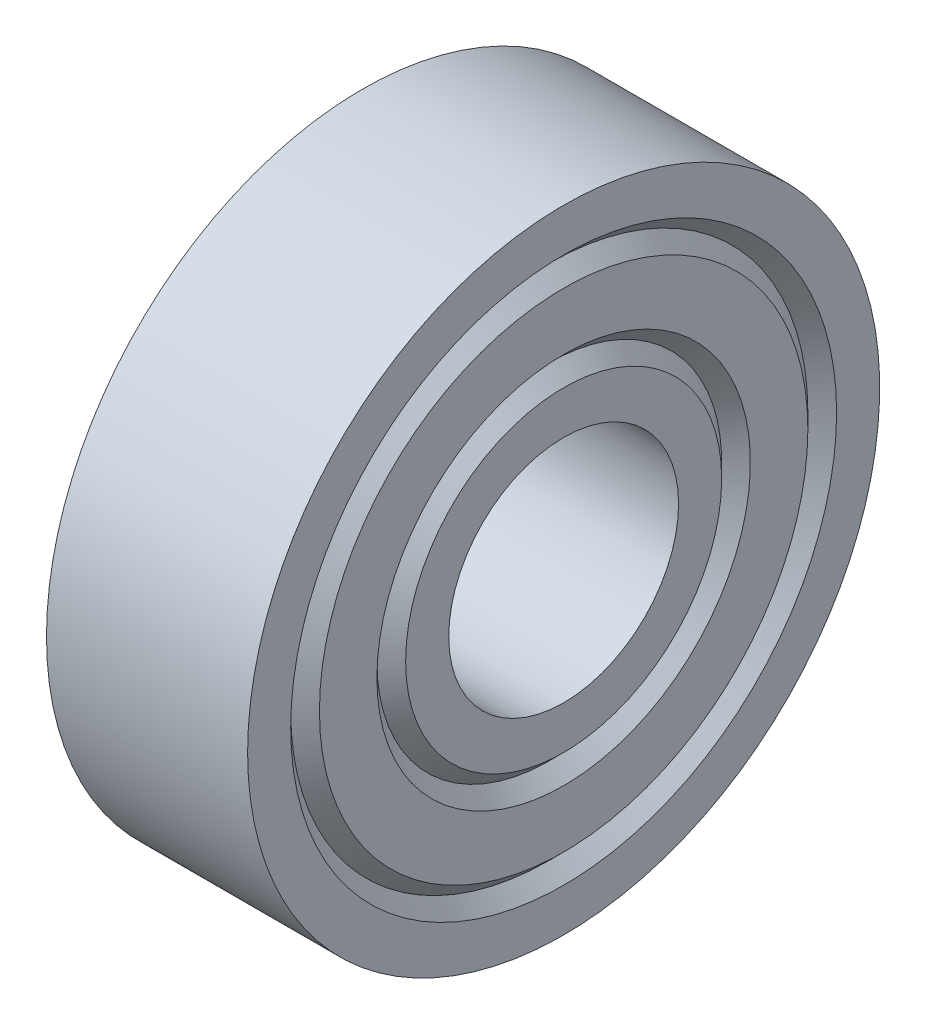
ISO-10303-21;
HEADER;
FILE_DESCRIPTION(('STEP AP214'),'2;1');
FILE_NAME('part.step','',(''),(''),'','','');
FILE_SCHEMA(('AUTOMOTIVE_DESIGN { 1 0 10303 214 1 1 1 1 }'));
ENDSEC;
DATA;
#1=APPLICATION_CONTEXT('core data for automotive mechanical design processes');
#2=APPLICATION_PROTOCOL_DEFINITION('international standard','automotive_design',2000,#1);
#3=PRODUCT_CONTEXT('',#1,'mechanical');
#4=PRODUCT('Part','Part','',(#3));
#5=PRODUCT_RELATED_PRODUCT_CATEGORY('part','',(#4));
#6=PRODUCT_DEFINITION_FORMATION('','',#4);
#7=PRODUCT_DEFINITION_CONTEXT('part definition',#1,'design');
#8=PRODUCT_DEFINITION('design','',#6,#7);
#9=PRODUCT_DEFINITION_SHAPE('','',#8);
#10=(LENGTH_UNIT() NAMED_UNIT(*) SI_UNIT(.MILLI.,.METRE.));
#11=(NAMED_UNIT(*) PLANE_ANGLE_UNIT() SI_UNIT($,.RADIAN.));
#12=(NAMED_UNIT(*) SI_UNIT($,.STERADIAN.) SOLID_ANGLE_UNIT());
#13=UNCERTAINTY_MEASURE_WITH_UNIT(LENGTH_MEASURE(1.E-05),#10,'distance_accuracy_value','');
#14=(GEOMETRIC_REPRESENTATION_CONTEXT(3) GLOBAL_UNCERTAINTY_ASSIGNED_CONTEXT((#13)) GLOBAL_UNIT_ASSIGNED_CONTEXT((#10,
#11,#12)) REPRESENTATION_CONTEXT('',''));
#15=CARTESIAN_POINT('',(0.,0.,0.));
#16=DIRECTION('',(0.,0.,1.));
#17=DIRECTION('',(1.,0.,0.));
#18=AXIS2_PLACEMENT_3D('',#15,#16,#17);
#19=CARTESIAN_POINT('',(-3.5,5.5,0.));
#20=DIRECTION('',(1.,0.,0.));
#21=DIRECTION('',(0.,0.,-1.));
#22=AXIS2_PLACEMENT_3D('',#19,#20,#21);
#23=PLANE('',#22);
#24=CARTESIAN_POINT('',(-3.5,0.,0.));
#25=DIRECTION('',(-1.,0.,0.));
#26=DIRECTION('',(0.,0.,1.));
#27=AXIS2_PLACEMENT_3D('',#24,#25,#26);
#28=CIRCLE('',#27,4.);
#29=CARTESIAN_POINT('',(-3.5,0.,4.));
#30=VERTEX_POINT('',#29);
#31=EDGE_CURVE('E85',#30,#30,#28,.T.);
#32=ORIENTED_EDGE('',*,*,#31,.F.);
#33=EDGE_LOOP('',(#32));
#34=FACE_BOUND('',#33,.T.);
#35=CARTESIAN_POINT('',(-3.5,0.,0.));
#36=DIRECTION('',(-1.,0.,0.));
#37=DIRECTION('',(0.,0.,1.));
#38=AXIS2_PLACEMENT_3D('',#35,#36,#37);
#39=CIRCLE('',#38,5.5);
#40=CARTESIAN_POINT('',(-3.5,0.,5.5));
#41=VERTEX_POINT('',#40);
#42=EDGE_CURVE('E10',#41,#41,#39,.T.);
#43=ORIENTED_EDGE('',*,*,#42,.T.);
#44=EDGE_LOOP('',(#43));
#45=FACE_BOUND('',#44,.T.);
#46=ADVANCED_FACE('F33',(#34,#45),#23,.F.);
#47=CARTESIAN_POINT('',(-3.,0.,0.));
#48=DIRECTION('',(1.,0.,0.));
#49=DIRECTION('',(0.,0.,-1.));
#50=AXIS2_PLACEMENT_3D('',#47,#48,#49);
#51=CONICAL_SURFACE('',#50,6.,0.785398163397448);
#52=ORIENTED_EDGE('',*,*,#42,.F.);
#53=EDGE_LOOP('',(#52));
#54=FACE_BOUND('',#53,.T.);
#55=CARTESIAN_POINT('',(-3.,0.,0.));
#56=DIRECTION('',(-1.,0.,0.));
#57=DIRECTION('',(0.,0.,1.));
#58=AXIS2_PLACEMENT_3D('',#55,#56,#57);
#59=CIRCLE('',#58,6.);
#60=CARTESIAN_POINT('',(-3.,0.,6.));
#61=VERTEX_POINT('',#60);
#62=EDGE_CURVE('E39',#61,#61,#59,.T.);
#63=ORIENTED_EDGE('',*,*,#62,.T.);
#64=EDGE_LOOP('',(#63));
#65=FACE_BOUND('',#64,.T.);
#66=ADVANCED_FACE('F92',(#54,#65),#51,.T.);
#67=CARTESIAN_POINT('',(-3.5,0.,0.));
#68=DIRECTION('',(-1.,0.,0.));
#69=DIRECTION('',(0.,0.,1.));
#70=AXIS2_PLACEMENT_3D('',#67,#68,#69);
#71=CONICAL_SURFACE('',#70,6.5,0.785398163397447);
#72=ORIENTED_EDGE('',*,*,#62,.F.);
#73=EDGE_LOOP('',(#72));
#74=FACE_BOUND('',#73,.T.);
#75=CARTESIAN_POINT('',(-3.5,0.,0.));
#76=DIRECTION('',(-1.,0.,0.));
#77=DIRECTION('',(0.,0.,1.));
#78=AXIS2_PLACEMENT_3D('',#75,#76,#77);
#79=CIRCLE('',#78,6.5);
#80=CARTESIAN_POINT('',(-3.5,0.,6.5));
#81=VERTEX_POINT('',#80);
#82=EDGE_CURVE('E43',#81,#81,#79,.T.);
#83=ORIENTED_EDGE('',*,*,#82,.T.);
#84=EDGE_LOOP('',(#83));
#85=FACE_BOUND('',#84,.T.);
#86=ADVANCED_FACE('F96',(#74,#85),#71,.F.);
#87=CARTESIAN_POINT('',(-3.5,8.5,0.));
#88=DIRECTION('',(1.,0.,0.));
#89=DIRECTION('',(0.,0.,-1.));
#90=AXIS2_PLACEMENT_3D('',#87,#88,#89);
#91=PLANE('',#90);
#92=ORIENTED_EDGE('',*,*,#82,.F.);
#93=EDGE_LOOP('',(#92));
#94=FACE_BOUND('',#93,.T.);
#95=CARTESIAN_POINT('',(-3.5,0.,0.));
#96=DIRECTION('',(-1.,0.,0.));
#97=DIRECTION('',(0.,0.,1.));
#98=AXIS2_PLACEMENT_3D('',#95,#96,#97);
#99=CIRCLE('',#98,8.5);
#100=CARTESIAN_POINT('',(-3.5,0.,8.5));
#101=VERTEX_POINT('',#100);
#102=EDGE_CURVE('E47',#101,#101,#99,.T.);
#103=ORIENTED_EDGE('',*,*,#102,.T.);
#104=EDGE_LOOP('',(#103));
#105=FACE_BOUND('',#104,.T.);
#106=ADVANCED_FACE('F101',(#94,#105),#91,.F.);
#107=CARTESIAN_POINT('',(-3.,0.,0.));
#108=DIRECTION('',(1.,0.,0.));
#109=DIRECTION('',(0.,0.,-1.));
#110=AXIS2_PLACEMENT_3D('',#107,#108,#109);
#111=CONICAL_SURFACE('',#110,9.,0.785398163397448);
#112=ORIENTED_EDGE('',*,*,#102,.F.);
#113=EDGE_LOOP('',(#112));
#114=FACE_BOUND('',#113,.T.);
#115=CARTESIAN_POINT('',(-3.,0.,0.));
#116=DIRECTION('',(-1.,0.,0.));
#117=DIRECTION('',(0.,0.,1.));
#118=AXIS2_PLACEMENT_3D('',#115,#116,#117);
#119=CIRCLE('',#118,9.);
#120=CARTESIAN_POINT('',(-3.,0.,9.));
#121=VERTEX_POINT('',#120);
#122=EDGE_CURVE('E52',#121,#121,#119,.T.);
#123=ORIENTED_EDGE('',*,*,#122,.T.);
#124=EDGE_LOOP('',(#123));
#125=FACE_BOUND('',#124,.T.);
#126=ADVANCED_FACE('F107',(#114,#125),#111,.T.);
#127=CARTESIAN_POINT('',(-3.5,0.,0.));
#128=DIRECTION('',(-1.,0.,0.));
#129=DIRECTION('',(0.,0.,1.));
#130=AXIS2_PLACEMENT_3D('',#127,#128,#129);
#131=CONICAL_SURFACE('',#130,9.5,0.785398163397448);
#132=ORIENTED_EDGE('',*,*,#122,.F.);
#133=EDGE_LOOP('',(#132));
#134=FACE_BOUND('',#133,.T.);
#135=CARTESIAN_POINT('',(-3.5,0.,0.));
#136=DIRECTION('',(-1.,0.,0.));
#137=DIRECTION('',(0.,0.,1.));
#138=AXIS2_PLACEMENT_3D('',#135,#136,#137);
#139=CIRCLE('',#138,9.5);
#140=CARTESIAN_POINT('',(-3.5,0.,9.5));
#141=VERTEX_POINT('',#140);
#142=EDGE_CURVE('E55',#141,#141,#139,.T.);
#143=ORIENTED_EDGE('',*,*,#142,.T.);
#144=EDGE_LOOP('',(#143));
#145=FACE_BOUND('',#144,.T.);
#146=ADVANCED_FACE('F111',(#134,#145),#131,.F.);
#147=CARTESIAN_POINT('',(-3.5,11.,0.));
#148=DIRECTION('',(1.,0.,0.));
#149=DIRECTION('',(0.,0.,-1.));
#150=AXIS2_PLACEMENT_3D('',#147,#148,#149);
#151=PLANE('',#150);
#152=ORIENTED_EDGE('',*,*,#142,.F.);
#153=EDGE_LOOP('',(#152));
#154=FACE_BOUND('',#153,.T.);
#155=CARTESIAN_POINT('',(-3.5,0.,0.));
#156=DIRECTION('',(-1.,0.,0.));
#157=DIRECTION('',(0.,0.,1.));
#158=AXIS2_PLACEMENT_3D('',#155,#156,#157);
#159=CIRCLE('',#158,11.);
#160=CARTESIAN_POINT('',(-3.5,0.,11.));
#161=VERTEX_POINT('',#160);
#162=EDGE_CURVE('E58',#161,#161,#159,.T.);
#163=ORIENTED_EDGE('',*,*,#162,.T.);
#164=EDGE_LOOP('',(#163));
#165=FACE_BOUND('',#164,.T.);
#166=ADVANCED_FACE('F115',(#154,#165),#151,.F.);
#167=CARTESIAN_POINT('',(0.,0.,0.));
#168=DIRECTION('',(-1.,0.,0.));
#169=DIRECTION('',(0.,0.,1.));
#170=AXIS2_PLACEMENT_3D('',#167,#168,#169);
#171=CYLINDRICAL_SURFACE('',#170,11.);
#172=ORIENTED_EDGE('',*,*,#162,.F.);
#173=EDGE_LOOP('',(#172));
#174=FACE_BOUND('',#173,.T.);
#175=CARTESIAN_POINT('',(3.5,0.,0.));
#176=DIRECTION('',(-1.,0.,0.));
#177=DIRECTION('',(0.,0.,1.));
#178=AXIS2_PLACEMENT_3D('',#175,#176,#177);
#179=CIRCLE('',#178,11.);
#180=CARTESIAN_POINT('',(3.5,0.,11.));
#181=VERTEX_POINT('',#180);
#182=EDGE_CURVE('E61',#181,#181,#179,.T.);
#183=ORIENTED_EDGE('',*,*,#182,.T.);
#184=EDGE_LOOP('',(#183));
#185=FACE_BOUND('',#184,.T.);
#186=ADVANCED_FACE('F119',(#174,#185),#171,.T.);
#187=CARTESIAN_POINT('',(3.5,9.5,0.));
#188=DIRECTION('',(-1.,0.,0.));
#189=DIRECTION('',(0.,0.,1.));
#190=AXIS2_PLACEMENT_3D('',#187,#188,#189);
#191=PLANE('',#190);
#192=ORIENTED_EDGE('',*,*,#182,.F.);
#193=EDGE_LOOP('',(#192));
#194=FACE_BOUND('',#193,.T.);
#195=CARTESIAN_POINT('',(3.5,0.,0.));
#196=DIRECTION('',(-1.,0.,0.));
#197=DIRECTION('',(0.,0.,1.));
#198=AXIS2_PLACEMENT_3D('',#195,#196,#197);
#199=CIRCLE('',#198,9.5);
#200=CARTESIAN_POINT('',(3.5,0.,9.5));
#201=VERTEX_POINT('',#200);
#202=EDGE_CURVE('E64',#201,#201,#199,.T.);
#203=ORIENTED_EDGE('',*,*,#202,.T.);
#204=EDGE_LOOP('',(#203));
#205=FACE_BOUND('',#204,.T.);
#206=ADVANCED_FACE('F123',(#194,#205),#191,.F.);
#207=CARTESIAN_POINT('',(3.,0.,0.));
#208=DIRECTION('',(1.,0.,0.));
#209=DIRECTION('',(0.,0.,-1.));
#210=AXIS2_PLACEMENT_3D('',#207,#208,#209);
#211=CONICAL_SURFACE('',#210,9.,0.785398163397448);
#212=ORIENTED_EDGE('',*,*,#202,.F.);
#213=EDGE_LOOP('',(#212));
#214=FACE_BOUND('',#213,.T.);
#215=CARTESIAN_POINT('',(3.,0.,0.));
#216=DIRECTION('',(-1.,0.,0.));
#217=DIRECTION('',(0.,0.,1.));
#218=AXIS2_PLACEMENT_3D('',#215,#216,#217);
#219=CIRCLE('',#218,9.);
#220=CARTESIAN_POINT('',(3.,0.,9.));
#221=VERTEX_POINT('',#220);
#222=EDGE_CURVE('E67',#221,#221,#219,.T.);
#223=ORIENTED_EDGE('',*,*,#222,.T.);
#224=EDGE_LOOP('',(#223));
#225=FACE_BOUND('',#224,.T.);
#226=ADVANCED_FACE('F127',(#214,#225),#211,.F.);
#227=CARTESIAN_POINT('',(3.5,0.,0.));
#228=DIRECTION('',(-1.,0.,0.));
#229=DIRECTION('',(0.,0.,1.));
#230=AXIS2_PLACEMENT_3D('',#227,#228,#229);
#231=CONICAL_SURFACE('',#230,8.5,0.785398163397452);
#232=ORIENTED_EDGE('',*,*,#222,.F.);
#233=EDGE_LOOP('',(#232));
#234=FACE_BOUND('',#233,.T.);
#235=CARTESIAN_POINT('',(3.5,0.,0.));
#236=DIRECTION('',(-1.,0.,0.));
#237=DIRECTION('',(0.,0.,1.));
#238=AXIS2_PLACEMENT_3D('',#235,#236,#237);
#239=CIRCLE('',#238,8.5);
#240=CARTESIAN_POINT('',(3.5,0.,8.5));
#241=VERTEX_POINT('',#240);
#242=EDGE_CURVE('E70',#241,#241,#239,.T.);
#243=ORIENTED_EDGE('',*,*,#242,.T.);
#244=EDGE_LOOP('',(#243));
#245=FACE_BOUND('',#244,.T.);
#246=ADVANCED_FACE('F131',(#234,#245),#231,.T.);
#247=CARTESIAN_POINT('',(3.5,6.5,0.));
#248=DIRECTION('',(-1.,0.,0.));
#249=DIRECTION('',(0.,0.,1.));
#250=AXIS2_PLACEMENT_3D('',#247,#248,#249);
#251=PLANE('',#250);
#252=ORIENTED_EDGE('',*,*,#242,.F.);
#253=EDGE_LOOP('',(#252));
#254=FACE_BOUND('',#253,.T.);
#255=CARTESIAN_POINT('',(3.5,0.,0.));
#256=DIRECTION('',(-1.,0.,0.));
#257=DIRECTION('',(0.,0.,1.));
#258=AXIS2_PLACEMENT_3D('',#255,#256,#257);
#259=CIRCLE('',#258,6.5);
#260=CARTESIAN_POINT('',(3.5,0.,6.5));
#261=VERTEX_POINT('',#260);
#262=EDGE_CURVE('E73',#261,#261,#259,.T.);
#263=ORIENTED_EDGE('',*,*,#262,.T.);
#264=EDGE_LOOP('',(#263));
#265=FACE_BOUND('',#264,.T.);
#266=ADVANCED_FACE('F135',(#254,#265),#251,.F.);
#267=CARTESIAN_POINT('',(3.,0.,0.));
#268=DIRECTION('',(1.,0.,0.));
#269=DIRECTION('',(0.,0.,-1.));
#270=AXIS2_PLACEMENT_3D('',#267,#268,#269);
#271=CONICAL_SURFACE('',#270,6.,0.785398163397449);
#272=ORIENTED_EDGE('',*,*,#262,.F.);
#273=EDGE_LOOP('',(#272));
#274=FACE_BOUND('',#273,.T.);
#275=CARTESIAN_POINT('',(3.,0.,0.));
#276=DIRECTION('',(-1.,0.,0.));
#277=DIRECTION('',(0.,0.,1.));
#278=AXIS2_PLACEMENT_3D('',#275,#276,#277);
#279=CIRCLE('',#278,6.);
#280=CARTESIAN_POINT('',(3.,0.,6.));
#281=VERTEX_POINT('',#280);
#282=EDGE_CURVE('E76',#281,#281,#279,.T.);
#283=ORIENTED_EDGE('',*,*,#282,.T.);
#284=EDGE_LOOP('',(#283));
#285=FACE_BOUND('',#284,.T.);
#286=ADVANCED_FACE('F139',(#274,#285),#271,.F.);
#287=CARTESIAN_POINT('',(3.5,0.,0.));
#288=DIRECTION('',(-1.,0.,0.));
#289=DIRECTION('',(0.,0.,1.));
#290=AXIS2_PLACEMENT_3D('',#287,#288,#289);
#291=CONICAL_SURFACE('',#290,5.5,0.785398163397452);
#292=ORIENTED_EDGE('',*,*,#282,.F.);
#293=EDGE_LOOP('',(#292));
#294=FACE_BOUND('',#293,.T.);
#295=CARTESIAN_POINT('',(3.5,0.,0.));
#296=DIRECTION('',(-1.,0.,0.));
#297=DIRECTION('',(0.,0.,1.));
#298=AXIS2_PLACEMENT_3D('',#295,#296,#297);
#299=CIRCLE('',#298,5.5);
#300=CARTESIAN_POINT('',(3.5,0.,5.5));
#301=VERTEX_POINT('',#300);
#302=EDGE_CURVE('E79',#301,#301,#299,.T.);
#303=ORIENTED_EDGE('',*,*,#302,.T.);
#304=EDGE_LOOP('',(#303));
#305=FACE_BOUND('',#304,.T.);
#306=ADVANCED_FACE('F143',(#294,#305),#291,.T.);
#307=CARTESIAN_POINT('',(3.5,4.,0.));
#308=DIRECTION('',(-1.,0.,0.));
#309=DIRECTION('',(0.,0.,1.));
#310=AXIS2_PLACEMENT_3D('',#307,#308,#309);
#311=PLANE('',#310);
#312=ORIENTED_EDGE('',*,*,#302,.F.);
#313=EDGE_LOOP('',(#312));
#314=FACE_BOUND('',#313,.T.);
#315=CARTESIAN_POINT('',(3.5,0.,0.));
#316=DIRECTION('',(-1.,0.,0.));
#317=DIRECTION('',(0.,0.,1.));
#318=AXIS2_PLACEMENT_3D('',#315,#316,#317);
#319=CIRCLE('',#318,4.);
#320=CARTESIAN_POINT('',(3.5,0.,4.));
#321=VERTEX_POINT('',#320);
#322=EDGE_CURVE('E82',#321,#321,#319,.T.);
#323=ORIENTED_EDGE('',*,*,#322,.T.);
#324=EDGE_LOOP('',(#323));
#325=FACE_BOUND('',#324,.T.);
#326=ADVANCED_FACE('F147',(#314,#325),#311,.F.);
#327=CARTESIAN_POINT('',(0.,0.,0.));
#328=DIRECTION('',(-1.,0.,0.));
#329=DIRECTION('',(0.,0.,1.));
#330=AXIS2_PLACEMENT_3D('',#327,#328,#329);
#331=CYLINDRICAL_SURFACE('',#330,4.);
#332=ORIENTED_EDGE('',*,*,#322,.F.);
#333=EDGE_LOOP('',(#332));
#334=FACE_BOUND('',#333,.T.);
#335=ORIENTED_EDGE('',*,*,#31,.T.);
#336=EDGE_LOOP('',(#335));
#337=FACE_BOUND('',#336,.T.);
#338=ADVANCED_FACE('F89',(#334,#337),#331,.F.);
#339=CLOSED_SHELL('',(#46,#66,#86,#106,#126,#146,#166,#186,#206,#226,#246,#266,#286,#306,#326,#338));
#340=MANIFOLD_SOLID_BREP('B2',#339);
#341=ADVANCED_BREP_SHAPE_REPRESENTATION('',(#18,#340),#14);
#342=SHAPE_DEFINITION_REPRESENTATION(#9,#341);
ENDSEC;
END-ISO-10303-21;
